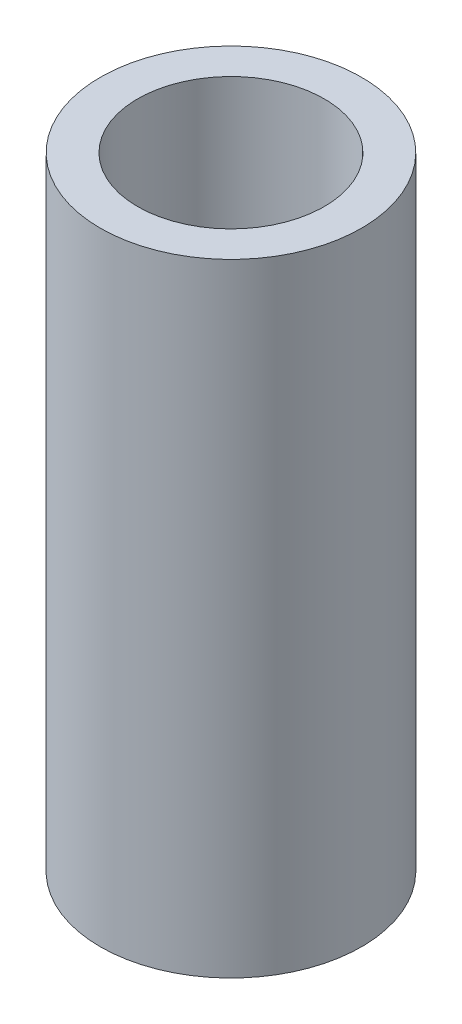
ISO-10303-21;
HEADER;
FILE_DESCRIPTION(('STEP AP214'),'2;1');
FILE_NAME('part.step','',(''),(''),'','','');
FILE_SCHEMA(('AUTOMOTIVE_DESIGN { 1 0 10303 214 1 1 1 1 }'));
ENDSEC;
DATA;
#1=APPLICATION_CONTEXT('core data for automotive mechanical design processes');
#2=APPLICATION_PROTOCOL_DEFINITION('international standard','automotive_design',2000,#1);
#3=PRODUCT_CONTEXT('',#1,'mechanical');
#4=PRODUCT('Part','Part','',(#3));
#5=PRODUCT_RELATED_PRODUCT_CATEGORY('part','',(#4));
#6=PRODUCT_DEFINITION_FORMATION('','',#4);
#7=PRODUCT_DEFINITION_CONTEXT('part definition',#1,'design');
#8=PRODUCT_DEFINITION('design','',#6,#7);
#9=PRODUCT_DEFINITION_SHAPE('','',#8);
#10=(LENGTH_UNIT() NAMED_UNIT(*) SI_UNIT(.MILLI.,.METRE.));
#11=(NAMED_UNIT(*) PLANE_ANGLE_UNIT() SI_UNIT($,.RADIAN.));
#12=(NAMED_UNIT(*) SI_UNIT($,.STERADIAN.) SOLID_ANGLE_UNIT());
#13=UNCERTAINTY_MEASURE_WITH_UNIT(LENGTH_MEASURE(1.E-05),#10,'distance_accuracy_value','');
#14=(GEOMETRIC_REPRESENTATION_CONTEXT(3) GLOBAL_UNCERTAINTY_ASSIGNED_CONTEXT((#13)) GLOBAL_UNIT_ASSIGNED_CONTEXT((#10,
#11,#12)) REPRESENTATION_CONTEXT('',''));
#15=CARTESIAN_POINT('',(0.,0.,0.));
#16=DIRECTION('',(0.,0.,1.));
#17=DIRECTION('',(1.,0.,0.));
#18=AXIS2_PLACEMENT_3D('',#15,#16,#17);
#19=CARTESIAN_POINT('',(0.,50.,0.));
#20=DIRECTION('',(0.,-1.,0.));
#21=DIRECTION('',(0.,0.,-1.));
#22=AXIS2_PLACEMENT_3D('',#19,#20,#21);
#23=CYLINDRICAL_SURFACE('',#22,10.5);
#24=CARTESIAN_POINT('',(0.,50.,0.));
#25=DIRECTION('',(0.,1.,0.));
#26=DIRECTION('',(0.,0.,1.));
#27=AXIS2_PLACEMENT_3D('',#24,#25,#26);
#28=CIRCLE('',#27,10.5);
#29=CARTESIAN_POINT('',(0.,50.,10.5));
#30=VERTEX_POINT('',#29);
#31=EDGE_CURVE('E10',#30,#30,#28,.T.);
#32=ORIENTED_EDGE('',*,*,#31,.F.);
#33=EDGE_LOOP('',(#32));
#34=FACE_BOUND('',#33,.T.);
#35=CARTESIAN_POINT('',(0.,0.,0.));
#36=DIRECTION('',(0.,1.,0.));
#37=DIRECTION('',(0.,0.,1.));
#38=AXIS2_PLACEMENT_3D('',#35,#36,#37);
#39=CIRCLE('',#38,10.5);
#40=CARTESIAN_POINT('',(0.,0.,10.5));
#41=VERTEX_POINT('',#40);
#42=EDGE_CURVE('E31',#41,#41,#39,.T.);
#43=ORIENTED_EDGE('',*,*,#42,.T.);
#44=EDGE_LOOP('',(#43));
#45=FACE_BOUND('',#44,.T.);
#46=ADVANCED_FACE('F28',(#34,#45),#23,.T.);
#47=CARTESIAN_POINT('',(0.,50.,0.));
#48=DIRECTION('',(0.,1.,0.));
#49=DIRECTION('',(0.,0.,1.));
#50=AXIS2_PLACEMENT_3D('',#47,#48,#49);
#51=PLANE('',#50);
#52=CARTESIAN_POINT('',(0.,50.,0.));
#53=DIRECTION('',(0.,1.,0.));
#54=DIRECTION('',(0.,0.,1.));
#55=AXIS2_PLACEMENT_3D('',#52,#53,#54);
#56=CIRCLE('',#55,7.5);
#57=CARTESIAN_POINT('',(0.,50.,7.5));
#58=VERTEX_POINT('',#57);
#59=EDGE_CURVE('E40',#58,#58,#56,.T.);
#60=ORIENTED_EDGE('',*,*,#59,.F.);
#61=EDGE_LOOP('',(#60));
#62=FACE_BOUND('',#61,.T.);
#63=ORIENTED_EDGE('',*,*,#31,.T.);
#64=EDGE_LOOP('',(#63));
#65=FACE_BOUND('',#64,.T.);
#66=ADVANCED_FACE('F55',(#62,#65),#51,.T.);
#67=CARTESIAN_POINT('',(0.,0.,0.));
#68=DIRECTION('',(0.,1.,0.));
#69=DIRECTION('',(0.,0.,1.));
#70=AXIS2_PLACEMENT_3D('',#67,#68,#69);
#71=PLANE('',#70);
#72=ORIENTED_EDGE('',*,*,#42,.F.);
#73=EDGE_LOOP('',(#72));
#74=FACE_BOUND('',#73,.T.);
#75=ADVANCED_FACE('F51',(#74),#71,.F.);
#76=CARTESIAN_POINT('',(0.,30.,0.));
#77=DIRECTION('',(0.,1.,0.));
#78=DIRECTION('',(0.,0.,1.));
#79=AXIS2_PLACEMENT_3D('',#76,#77,#78);
#80=CYLINDRICAL_SURFACE('',#79,7.5);
#81=CARTESIAN_POINT('',(0.,30.,0.));
#82=DIRECTION('',(0.,1.,0.));
#83=DIRECTION('',(0.,0.,1.));
#84=AXIS2_PLACEMENT_3D('',#81,#82,#83);
#85=CIRCLE('',#84,7.5);
#86=CARTESIAN_POINT('',(0.,30.,7.5));
#87=VERTEX_POINT('',#86);
#88=EDGE_CURVE('E38',#87,#87,#85,.T.);
#89=ORIENTED_EDGE('',*,*,#88,.F.);
#90=EDGE_LOOP('',(#89));
#91=FACE_BOUND('',#90,.T.);
#92=ORIENTED_EDGE('',*,*,#59,.T.);
#93=EDGE_LOOP('',(#92));
#94=FACE_BOUND('',#93,.T.);
#95=ADVANCED_FACE('F48',(#91,#94),#80,.F.);
#96=CARTESIAN_POINT('',(0.,30.,0.));
#97=DIRECTION('',(0.,1.,0.));
#98=DIRECTION('',(0.,0.,1.));
#99=AXIS2_PLACEMENT_3D('',#96,#97,#98);
#100=PLANE('',#99);
#101=ORIENTED_EDGE('',*,*,#88,.T.);
#102=EDGE_LOOP('',(#101));
#103=FACE_BOUND('',#102,.T.);
#104=ADVANCED_FACE('F46',(#103),#100,.T.);
#105=CLOSED_SHELL('',(#46,#66,#75,#95,#104));
#106=MANIFOLD_SOLID_BREP('B2',#105);
#107=ADVANCED_BREP_SHAPE_REPRESENTATION('',(#18,#106),#14);
#108=SHAPE_DEFINITION_REPRESENTATION(#9,#107);
ENDSEC;
END-ISO-10303-21;
